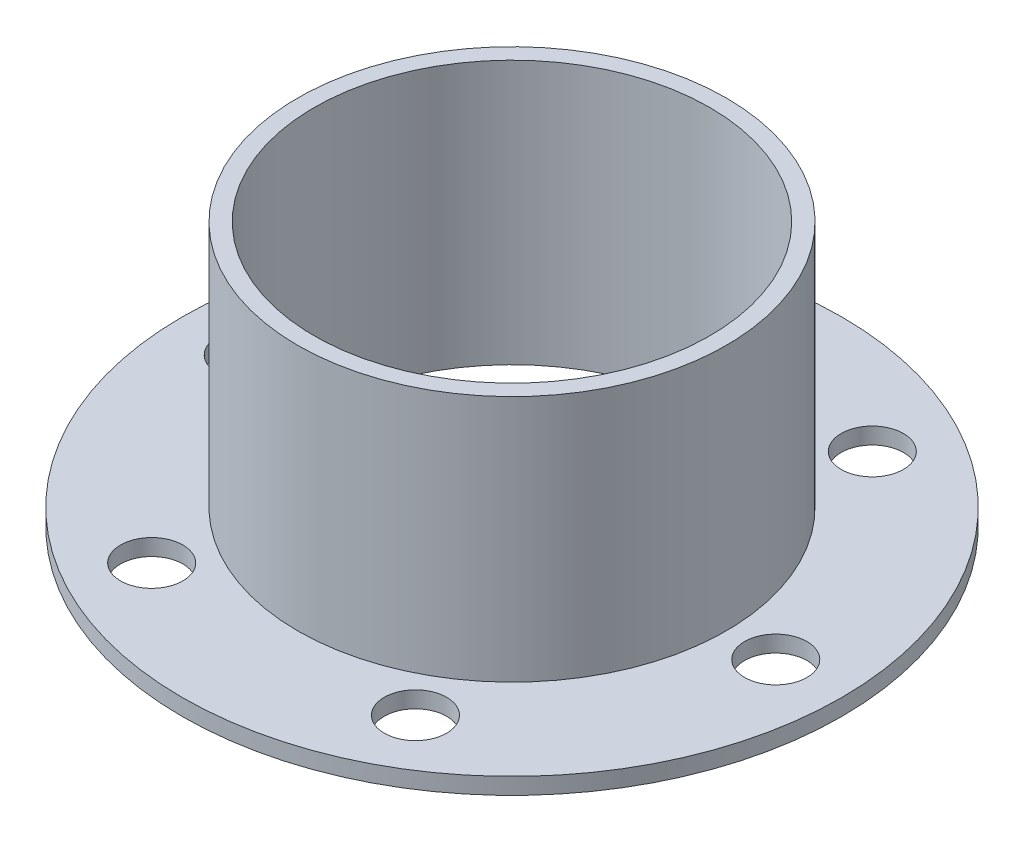
ISO-10303-21;
HEADER;
FILE_DESCRIPTION(('STEP AP214'),'2;1');
FILE_NAME('part.step','',(''),(''),'','','');
FILE_SCHEMA(('AUTOMOTIVE_DESIGN { 1 0 10303 214 1 1 1 1 }'));
ENDSEC;
DATA;
#1=APPLICATION_CONTEXT('core data for automotive mechanical design processes');
#2=APPLICATION_PROTOCOL_DEFINITION('international standard','automotive_design',2000,#1);
#3=PRODUCT_CONTEXT('',#1,'mechanical');
#4=PRODUCT('Part','Part','',(#3));
#5=PRODUCT_RELATED_PRODUCT_CATEGORY('part','',(#4));
#6=PRODUCT_DEFINITION_FORMATION('','',#4);
#7=PRODUCT_DEFINITION_CONTEXT('part definition',#1,'design');
#8=PRODUCT_DEFINITION('design','',#6,#7);
#9=PRODUCT_DEFINITION_SHAPE('','',#8);
#10=(LENGTH_UNIT() NAMED_UNIT(*) SI_UNIT(.MILLI.,.METRE.));
#11=(NAMED_UNIT(*) PLANE_ANGLE_UNIT() SI_UNIT($,.RADIAN.));
#12=(NAMED_UNIT(*) SI_UNIT($,.STERADIAN.) SOLID_ANGLE_UNIT());
#13=UNCERTAINTY_MEASURE_WITH_UNIT(LENGTH_MEASURE(1.E-05),#10,'distance_accuracy_value','');
#14=(GEOMETRIC_REPRESENTATION_CONTEXT(3) GLOBAL_UNCERTAINTY_ASSIGNED_CONTEXT((#13)) GLOBAL_UNIT_ASSIGNED_CONTEXT((#10,
#11,#12)) REPRESENTATION_CONTEXT('',''));
#15=CARTESIAN_POINT('',(0.,0.,0.));
#16=DIRECTION('',(0.,0.,1.));
#17=DIRECTION('',(1.,0.,0.));
#18=AXIS2_PLACEMENT_3D('',#15,#16,#17);
#19=CARTESIAN_POINT('',(-38.1,0.,0.));
#20=DIRECTION('',(0.,1.,0.));
#21=DIRECTION('',(0.,0.,1.));
#22=AXIS2_PLACEMENT_3D('',#19,#20,#21);
#23=PLANE('',#22);
#24=CARTESIAN_POINT('',(-25.4000000000005,0.,43.9940905122492));
#25=DIRECTION('',(0.,1.,0.));
#26=DIRECTION('',(0.866025403784433,0.,0.50000000000001));
#27=AXIS2_PLACEMENT_3D('',#24,#25,#26);
#28=CIRCLE('',#27,6.);
#29=CARTESIAN_POINT('',(-20.2038475772939,0.,46.9940905122493));
#30=VERTEX_POINT('',#29);
#31=EDGE_CURVE('E71',#30,#30,#28,.T.);
#32=ORIENTED_EDGE('',*,*,#31,.T.);
#33=EDGE_LOOP('',(#32));
#34=FACE_BOUND('',#33,.T.);
#35=CARTESIAN_POINT('',(25.3999999999996,0.,43.9940905122497));
#36=DIRECTION('',(0.,1.,0.));
#37=DIRECTION('',(0.866025403784443,0.,-0.499999999999992));
#38=AXIS2_PLACEMENT_3D('',#35,#36,#37);
#39=CIRCLE('',#38,6.);
#40=CARTESIAN_POINT('',(30.5961524227063,0.,40.9940905122498));
#41=VERTEX_POINT('',#40);
#42=EDGE_CURVE('E70',#41,#41,#39,.T.);
#43=ORIENTED_EDGE('',*,*,#42,.T.);
#44=EDGE_LOOP('',(#43));
#45=FACE_BOUND('',#44,.T.);
#46=CARTESIAN_POINT('',(50.8,0.,0.));
#47=DIRECTION('',(0.,1.,0.));
#48=DIRECTION('',(0.,0.,-1.));
#49=AXIS2_PLACEMENT_3D('',#46,#47,#48);
#50=CIRCLE('',#49,6.);
#51=CARTESIAN_POINT('',(50.8,0.,-6.));
#52=VERTEX_POINT('',#51);
#53=EDGE_CURVE('E77',#52,#52,#50,.T.);
#54=ORIENTED_EDGE('',*,*,#53,.T.);
#55=EDGE_LOOP('',(#54));
#56=FACE_BOUND('',#55,.T.);
#57=CARTESIAN_POINT('',(25.4000000000002,0.,-43.9940905122494));
#58=DIRECTION('',(0.,1.,0.));
#59=DIRECTION('',(-0.866025403784436,0.,-0.500000000000004));
#60=AXIS2_PLACEMENT_3D('',#57,#58,#59);
#61=CIRCLE('',#60,6.);
#62=CARTESIAN_POINT('',(20.2038475772936,0.,-46.9940905122494));
#63=VERTEX_POINT('',#62);
#64=EDGE_CURVE('E83',#63,#63,#61,.T.);
#65=ORIENTED_EDGE('',*,*,#64,.T.);
#66=EDGE_LOOP('',(#65));
#67=FACE_BOUND('',#66,.T.);
#68=CARTESIAN_POINT('',(-25.3999999999999,0.,-43.9940905122495));
#69=DIRECTION('',(0.,1.,0.));
#70=DIRECTION('',(-0.86602540378444,0.,0.499999999999998));
#71=AXIS2_PLACEMENT_3D('',#68,#69,#70);
#72=CIRCLE('',#71,6.);
#73=CARTESIAN_POINT('',(-30.5961524227065,0.,-40.9940905122495));
#74=VERTEX_POINT('',#73);
#75=EDGE_CURVE('E63',#74,#74,#72,.T.);
#76=ORIENTED_EDGE('',*,*,#75,.T.);
#77=EDGE_LOOP('',(#76));
#78=FACE_BOUND('',#77,.T.);
#79=CARTESIAN_POINT('',(-50.8,0.,0.));
#80=DIRECTION('',(0.,1.,0.));
#81=DIRECTION('',(0.,0.,1.));
#82=AXIS2_PLACEMENT_3D('',#79,#80,#81);
#83=CIRCLE('',#82,6.);
#84=CARTESIAN_POINT('',(-50.8,0.,6.));
#85=VERTEX_POINT('',#84);
#86=EDGE_CURVE('E57',#85,#85,#83,.T.);
#87=ORIENTED_EDGE('',*,*,#86,.T.);
#88=EDGE_LOOP('',(#87));
#89=FACE_BOUND('',#88,.T.);
#90=CARTESIAN_POINT('',(0.,0.,0.));
#91=DIRECTION('',(0.,-1.,0.));
#92=DIRECTION('',(0.,0.,-1.));
#93=AXIS2_PLACEMENT_3D('',#90,#91,#92);
#94=CIRCLE('',#93,38.1);
#95=CARTESIAN_POINT('',(0.,0.,-38.1));
#96=VERTEX_POINT('',#95);
#97=EDGE_CURVE('E54',#96,#96,#94,.T.);
#98=ORIENTED_EDGE('',*,*,#97,.F.);
#99=EDGE_LOOP('',(#98));
#100=FACE_BOUND('',#99,.T.);
#101=CARTESIAN_POINT('',(0.,0.,0.));
#102=DIRECTION('',(0.,-1.,0.));
#103=DIRECTION('',(0.,0.,-1.));
#104=AXIS2_PLACEMENT_3D('',#101,#102,#103);
#105=CIRCLE('',#104,63.5);
#106=CARTESIAN_POINT('',(0.,0.,-63.5));
#107=VERTEX_POINT('',#106);
#108=EDGE_CURVE('E10',#107,#107,#105,.T.);
#109=ORIENTED_EDGE('',*,*,#108,.T.);
#110=EDGE_LOOP('',(#109));
#111=FACE_BOUND('',#110,.T.);
#112=ADVANCED_FACE('F32',(#34,#45,#56,#67,#78,#89,#100,#111),#23,.F.);
#113=CARTESIAN_POINT('',(0.,0.,0.));
#114=DIRECTION('',(0.,-1.,0.));
#115=DIRECTION('',(0.,0.,-1.));
#116=AXIS2_PLACEMENT_3D('',#113,#114,#115);
#117=CYLINDRICAL_SURFACE('',#116,63.5);
#118=ORIENTED_EDGE('',*,*,#108,.F.);
#119=EDGE_LOOP('',(#118));
#120=FACE_BOUND('',#119,.T.);
#121=CARTESIAN_POINT('',(0.,3.175,0.));
#122=DIRECTION('',(0.,-1.,0.));
#123=DIRECTION('',(0.,0.,-1.));
#124=AXIS2_PLACEMENT_3D('',#121,#122,#123);
#125=CIRCLE('',#124,63.5);
#126=CARTESIAN_POINT('',(0.,3.175,-63.5));
#127=VERTEX_POINT('',#126);
#128=EDGE_CURVE('E39',#127,#127,#125,.T.);
#129=ORIENTED_EDGE('',*,*,#128,.T.);
#130=EDGE_LOOP('',(#129));
#131=FACE_BOUND('',#130,.T.);
#132=ADVANCED_FACE('F105',(#120,#131),#117,.T.);
#133=CARTESIAN_POINT('',(-63.5,3.175,0.));
#134=DIRECTION('',(0.,-1.,0.));
#135=DIRECTION('',(0.,0.,-1.));
#136=AXIS2_PLACEMENT_3D('',#133,#134,#135);
#137=PLANE('',#136);
#138=CARTESIAN_POINT('',(-25.4000000000005,3.175,43.9940905122492));
#139=DIRECTION('',(0.,-1.,0.));
#140=DIRECTION('',(-0.866025403784433,0.,-0.50000000000001));
#141=AXIS2_PLACEMENT_3D('',#138,#139,#140);
#142=CIRCLE('',#141,6.);
#143=CARTESIAN_POINT('',(-20.2038475772939,3.175,46.9940905122493));
#144=VERTEX_POINT('',#143);
#145=EDGE_CURVE('E67',#144,#144,#142,.T.);
#146=ORIENTED_EDGE('',*,*,#145,.T.);
#147=EDGE_LOOP('',(#146));
#148=FACE_BOUND('',#147,.T.);
#149=CARTESIAN_POINT('',(25.3999999999996,3.175,43.9940905122497));
#150=DIRECTION('',(0.,-1.,0.));
#151=DIRECTION('',(-0.866025403784443,0.,0.499999999999992));
#152=AXIS2_PLACEMENT_3D('',#149,#150,#151);
#153=CIRCLE('',#152,6.);
#154=CARTESIAN_POINT('',(30.5961524227063,3.175,40.9940905122498));
#155=VERTEX_POINT('',#154);
#156=EDGE_CURVE('E74',#155,#155,#153,.T.);
#157=ORIENTED_EDGE('',*,*,#156,.T.);
#158=EDGE_LOOP('',(#157));
#159=FACE_BOUND('',#158,.T.);
#160=CARTESIAN_POINT('',(50.8,3.175,0.));
#161=DIRECTION('',(0.,-1.,0.));
#162=DIRECTION('',(0.,0.,1.));
#163=AXIS2_PLACEMENT_3D('',#160,#161,#162);
#164=CIRCLE('',#163,6.);
#165=CARTESIAN_POINT('',(50.8,3.175,-6.));
#166=VERTEX_POINT('',#165);
#167=EDGE_CURVE('E80',#166,#166,#164,.T.);
#168=ORIENTED_EDGE('',*,*,#167,.T.);
#169=EDGE_LOOP('',(#168));
#170=FACE_BOUND('',#169,.T.);
#171=CARTESIAN_POINT('',(25.4000000000002,3.175,-43.9940905122494));
#172=DIRECTION('',(0.,-1.,0.));
#173=DIRECTION('',(0.866025403784436,0.,0.500000000000004));
#174=AXIS2_PLACEMENT_3D('',#171,#172,#173);
#175=CIRCLE('',#174,6.);
#176=CARTESIAN_POINT('',(20.2038475772936,3.175,-46.9940905122494));
#177=VERTEX_POINT('',#176);
#178=EDGE_CURVE('E66',#177,#177,#175,.T.);
#179=ORIENTED_EDGE('',*,*,#178,.T.);
#180=EDGE_LOOP('',(#179));
#181=FACE_BOUND('',#180,.T.);
#182=CARTESIAN_POINT('',(-25.3999999999999,3.175,-43.9940905122495));
#183=DIRECTION('',(0.,-1.,0.));
#184=DIRECTION('',(0.86602540378444,0.,-0.499999999999998));
#185=AXIS2_PLACEMENT_3D('',#182,#183,#184);
#186=CIRCLE('',#185,6.);
#187=CARTESIAN_POINT('',(-30.5961524227065,3.175,-40.9940905122495));
#188=VERTEX_POINT('',#187);
#189=EDGE_CURVE('E60',#188,#188,#186,.T.);
#190=ORIENTED_EDGE('',*,*,#189,.T.);
#191=EDGE_LOOP('',(#190));
#192=FACE_BOUND('',#191,.T.);
#193=CARTESIAN_POINT('',(-50.8,3.175,0.));
#194=DIRECTION('',(0.,-1.,0.));
#195=DIRECTION('',(0.,0.,-1.));
#196=AXIS2_PLACEMENT_3D('',#193,#194,#195);
#197=CIRCLE('',#196,6.);
#198=CARTESIAN_POINT('',(-50.8,3.175,6.));
#199=VERTEX_POINT('',#198);
#200=EDGE_CURVE('E35',#199,#199,#197,.T.);
#201=ORIENTED_EDGE('',*,*,#200,.T.);
#202=EDGE_LOOP('',(#201));
#203=FACE_BOUND('',#202,.T.);
#204=ORIENTED_EDGE('',*,*,#128,.F.);
#205=EDGE_LOOP('',(#204));
#206=FACE_BOUND('',#205,.T.);
#207=CARTESIAN_POINT('',(0.,3.175,0.));
#208=DIRECTION('',(0.,-1.,0.));
#209=DIRECTION('',(0.,0.,-1.));
#210=AXIS2_PLACEMENT_3D('',#207,#208,#209);
#211=CIRCLE('',#210,41.275);
#212=CARTESIAN_POINT('',(0.,3.175,-41.275));
#213=VERTEX_POINT('',#212);
#214=EDGE_CURVE('E43',#213,#213,#211,.T.);
#215=ORIENTED_EDGE('',*,*,#214,.T.);
#216=EDGE_LOOP('',(#215));
#217=FACE_BOUND('',#216,.T.);
#218=ADVANCED_FACE('F101',(#148,#159,#170,#181,#192,#203,#206,#217),#137,.F.);
#219=CARTESIAN_POINT('',(0.,0.,0.));
#220=DIRECTION('',(0.,-1.,0.));
#221=DIRECTION('',(0.,0.,-1.));
#222=AXIS2_PLACEMENT_3D('',#219,#220,#221);
#223=CYLINDRICAL_SURFACE('',#222,41.275);
#224=ORIENTED_EDGE('',*,*,#214,.F.);
#225=EDGE_LOOP('',(#224));
#226=FACE_BOUND('',#225,.T.);
#227=CARTESIAN_POINT('',(0.,50.8,0.));
#228=DIRECTION('',(0.,-1.,0.));
#229=DIRECTION('',(0.,0.,-1.));
#230=AXIS2_PLACEMENT_3D('',#227,#228,#229);
#231=CIRCLE('',#230,41.275);
#232=CARTESIAN_POINT('',(0.,50.8,-41.275));
#233=VERTEX_POINT('',#232);
#234=EDGE_CURVE('E48',#233,#233,#231,.T.);
#235=ORIENTED_EDGE('',*,*,#234,.T.);
#236=EDGE_LOOP('',(#235));
#237=FACE_BOUND('',#236,.T.);
#238=ADVANCED_FACE('F104',(#226,#237),#223,.T.);
#239=CARTESIAN_POINT('',(-41.275,50.8,0.));
#240=DIRECTION('',(0.,-1.,0.));
#241=DIRECTION('',(0.,0.,-1.));
#242=AXIS2_PLACEMENT_3D('',#239,#240,#241);
#243=PLANE('',#242);
#244=ORIENTED_EDGE('',*,*,#234,.F.);
#245=EDGE_LOOP('',(#244));
#246=FACE_BOUND('',#245,.T.);
#247=CARTESIAN_POINT('',(0.,50.8,0.));
#248=DIRECTION('',(0.,-1.,0.));
#249=DIRECTION('',(0.,0.,-1.));
#250=AXIS2_PLACEMENT_3D('',#247,#248,#249);
#251=CIRCLE('',#250,38.1);
#252=CARTESIAN_POINT('',(0.,50.8,-38.1));
#253=VERTEX_POINT('',#252);
#254=EDGE_CURVE('E51',#253,#253,#251,.T.);
#255=ORIENTED_EDGE('',*,*,#254,.T.);
#256=EDGE_LOOP('',(#255));
#257=FACE_BOUND('',#256,.T.);
#258=ADVANCED_FACE('F119',(#246,#257),#243,.F.);
#259=CARTESIAN_POINT('',(0.,0.,0.));
#260=DIRECTION('',(0.,-1.,0.));
#261=DIRECTION('',(0.,0.,-1.));
#262=AXIS2_PLACEMENT_3D('',#259,#260,#261);
#263=CYLINDRICAL_SURFACE('',#262,38.1);
#264=ORIENTED_EDGE('',*,*,#254,.F.);
#265=EDGE_LOOP('',(#264));
#266=FACE_BOUND('',#265,.T.);
#267=ORIENTED_EDGE('',*,*,#97,.T.);
#268=EDGE_LOOP('',(#267));
#269=FACE_BOUND('',#268,.T.);
#270=ADVANCED_FACE('F125',(#266,#269),#263,.F.);
#271=CARTESIAN_POINT('',(-50.8,0.,0.));
#272=DIRECTION('',(0.,1.,0.));
#273=DIRECTION('',(0.,0.,1.));
#274=AXIS2_PLACEMENT_3D('',#271,#272,#273);
#275=CYLINDRICAL_SURFACE('',#274,6.);
#276=CARTESIAN_POINT('',(-50.8,0.,6.));
#277=CARTESIAN_POINT('',(-50.8,0.0330729166666666,6.));
#278=CARTESIAN_POINT('',(-50.8,0.0661458333333333,6.));
#279=CARTESIAN_POINT('',(-50.8,0.132291666666667,6.));
#280=CARTESIAN_POINT('',(-50.8,0.165364583333333,6.));
#281=CARTESIAN_POINT('',(-50.8,0.231510416666666,6.));
#282=CARTESIAN_POINT('',(-50.8,0.264583333333333,6.));
#283=CARTESIAN_POINT('',(-50.8,0.330729166666666,6.));
#284=CARTESIAN_POINT('',(-50.8,0.363802083333333,6.));
#285=CARTESIAN_POINT('',(-50.8,0.429947916666666,6.));
#286=CARTESIAN_POINT('',(-50.8,0.463020833333333,6.));
#287=CARTESIAN_POINT('',(-50.8,0.529166666666666,6.));
#288=CARTESIAN_POINT('',(-50.8,0.562239583333333,6.));
#289=CARTESIAN_POINT('',(-50.8,0.628385416666666,6.));
#290=CARTESIAN_POINT('',(-50.8,0.661458333333333,6.));
#291=CARTESIAN_POINT('',(-50.8,0.727604166666666,6.));
#292=CARTESIAN_POINT('',(-50.8,0.760677083333333,6.));
#293=CARTESIAN_POINT('',(-50.8,0.826822916666666,6.));
#294=CARTESIAN_POINT('',(-50.8,0.859895833333333,6.));
#295=CARTESIAN_POINT('',(-50.8,0.926041666666666,6.));
#296=CARTESIAN_POINT('',(-50.8,0.959114583333332,6.));
#297=CARTESIAN_POINT('',(-50.8,1.02526041666667,6.));
#298=CARTESIAN_POINT('',(-50.8,1.05833333333333,6.));
#299=CARTESIAN_POINT('',(-50.8,1.12447916666667,6.));
#300=CARTESIAN_POINT('',(-50.8,1.15755208333333,6.));
#301=CARTESIAN_POINT('',(-50.8,1.22369791666667,6.));
#302=CARTESIAN_POINT('',(-50.8,1.25677083333333,6.));
#303=CARTESIAN_POINT('',(-50.8,1.32291666666667,6.));
#304=CARTESIAN_POINT('',(-50.8,1.35598958333333,6.));
#305=CARTESIAN_POINT('',(-50.8,1.42213541666667,6.));
#306=CARTESIAN_POINT('',(-50.8,1.45520833333333,6.));
#307=CARTESIAN_POINT('',(-50.8,1.52135416666667,6.));
#308=CARTESIAN_POINT('',(-50.8,1.55442708333333,6.));
#309=CARTESIAN_POINT('',(-50.8,1.62057291666667,6.));
#310=CARTESIAN_POINT('',(-50.8,1.65364583333333,6.));
#311=CARTESIAN_POINT('',(-50.8,1.71979166666667,6.));
#312=CARTESIAN_POINT('',(-50.8,1.75286458333333,6.));
#313=CARTESIAN_POINT('',(-50.8,1.81901041666666,6.));
#314=CARTESIAN_POINT('',(-50.8,1.85208333333333,6.));
#315=CARTESIAN_POINT('',(-50.8,1.91822916666666,6.));
#316=CARTESIAN_POINT('',(-50.8,1.95130208333333,6.));
#317=CARTESIAN_POINT('',(-50.8,2.01744791666666,6.));
#318=CARTESIAN_POINT('',(-50.8,2.05052083333333,6.));
#319=CARTESIAN_POINT('',(-50.8,2.11666666666666,6.));
#320=CARTESIAN_POINT('',(-50.8,2.14973958333333,6.));
#321=CARTESIAN_POINT('',(-50.8,2.21588541666666,6.));
#322=CARTESIAN_POINT('',(-50.8,2.24895833333333,6.));
#323=CARTESIAN_POINT('',(-50.8,2.31510416666666,6.));
#324=CARTESIAN_POINT('',(-50.8,2.34817708333333,6.));
#325=CARTESIAN_POINT('',(-50.8,2.41432291666666,6.));
#326=CARTESIAN_POINT('',(-50.8,2.44739583333333,6.));
#327=CARTESIAN_POINT('',(-50.8,2.51354166666666,6.));
#328=CARTESIAN_POINT('',(-50.8,2.54661458333333,6.));
#329=CARTESIAN_POINT('',(-50.8,2.61276041666666,6.));
#330=CARTESIAN_POINT('',(-50.8,2.64583333333333,6.));
#331=CARTESIAN_POINT('',(-50.8,2.71197916666666,6.));
#332=CARTESIAN_POINT('',(-50.8,2.74505208333333,6.));
#333=CARTESIAN_POINT('',(-50.8,2.81119791666666,6.));
#334=CARTESIAN_POINT('',(-50.8,2.84427083333333,6.));
#335=CARTESIAN_POINT('',(-50.8,2.91041666666666,6.));
#336=CARTESIAN_POINT('',(-50.8,2.94348958333333,6.));
#337=CARTESIAN_POINT('',(-50.8,3.00963541666666,6.));
#338=CARTESIAN_POINT('',(-50.8,3.04270833333333,6.));
#339=CARTESIAN_POINT('',(-50.8,3.10885416666666,6.));
#340=CARTESIAN_POINT('',(-50.8,3.14192708333333,6.));
#341=CARTESIAN_POINT('',(-50.8,3.175,6.));
#342=B_SPLINE_CURVE_WITH_KNOTS('',3,(#276,#277,#278,#279,#280,#281,#282,#283,#284,#285,#286,
#287,#288,#289,#290,#291,#292,#293,#294,#295,#296,#297,#298,#299,#300,#301,#302,#303,#304,#305,
#306,#307,#308,#309,#310,#311,#312,#313,#314,#315,#316,#317,#318,#319,#320,#321,#322,#323,#324,
#325,#326,#327,#328,#329,#330,#331,#332,#333,#334,#335,#336,#337,#338,#339,#340,#341),
.UNSPECIFIED.,.F.,.F.,(4,2,2,2,2,2,2,2,2,2,2,2,2,2,2,2,2,2,2,2,2,2,2,2,2,2,2,2,2,2,2,2,4),(0.,
0.0992187499999999,0.1984375,0.29765625,0.396875,0.496093749999999,0.595312499999999,
0.694531249999999,0.793749999999999,0.892968749999999,0.992187499999999,1.09140625,1.190625,
1.28984375,1.3890625,1.48828125,1.5875,1.68671875,1.7859375,1.88515625,1.984375,2.08359375,
2.1828125,2.28203125,2.38125,2.48046875,2.5796875,2.67890625,2.778125,2.87734375,2.9765625,
3.07578125,3.175),.UNSPECIFIED.);
#343=EDGE_CURVE('BSEAM131',#85,#199,#342,.T.);
#344=ORIENTED_EDGE('',*,*,#86,.F.);
#345=ORIENTED_EDGE('',*,*,#200,.F.);
#346=ORIENTED_EDGE('',*,*,#343,.T.);
#347=ORIENTED_EDGE('',*,*,#343,.F.);
#348=EDGE_LOOP('',(#344,#346,#345,#347));
#349=FACE_BOUND('',#348,.T.);
#350=ADVANCED_FACE('F131',(#349),#275,.F.);
#351=CARTESIAN_POINT('',(-25.3999999999999,0.,-43.9940905122495));
#352=DIRECTION('',(0.,1.,0.));
#353=DIRECTION('',(-0.86602540378444,0.,0.499999999999998));
#354=AXIS2_PLACEMENT_3D('',#351,#352,#353);
#355=CYLINDRICAL_SURFACE('',#354,6.);
#356=CARTESIAN_POINT('',(-30.5961524227065,0.,-40.9940905122495));
#357=CARTESIAN_POINT('',(-30.5961524227065,0.0330729166666666,-40.9940905122495));
#358=CARTESIAN_POINT('',(-30.5961524227065,0.0661458333333333,-40.9940905122495));
#359=CARTESIAN_POINT('',(-30.5961524227065,0.132291666666667,-40.9940905122495));
#360=CARTESIAN_POINT('',(-30.5961524227065,0.165364583333333,-40.9940905122495));
#361=CARTESIAN_POINT('',(-30.5961524227065,0.231510416666666,-40.9940905122495));
#362=CARTESIAN_POINT('',(-30.5961524227065,0.264583333333333,-40.9940905122495));
#363=CARTESIAN_POINT('',(-30.5961524227065,0.330729166666666,-40.9940905122495));
#364=CARTESIAN_POINT('',(-30.5961524227065,0.363802083333333,-40.9940905122495));
#365=CARTESIAN_POINT('',(-30.5961524227065,0.429947916666666,-40.9940905122495));
#366=CARTESIAN_POINT('',(-30.5961524227065,0.463020833333333,-40.9940905122495));
#367=CARTESIAN_POINT('',(-30.5961524227065,0.529166666666666,-40.9940905122495));
#368=CARTESIAN_POINT('',(-30.5961524227065,0.562239583333333,-40.9940905122495));
#369=CARTESIAN_POINT('',(-30.5961524227065,0.628385416666666,-40.9940905122495));
#370=CARTESIAN_POINT('',(-30.5961524227065,0.661458333333333,-40.9940905122495));
#371=CARTESIAN_POINT('',(-30.5961524227065,0.727604166666666,-40.9940905122495));
#372=CARTESIAN_POINT('',(-30.5961524227065,0.760677083333333,-40.9940905122495));
#373=CARTESIAN_POINT('',(-30.5961524227065,0.826822916666666,-40.9940905122495));
#374=CARTESIAN_POINT('',(-30.5961524227065,0.859895833333333,-40.9940905122495));
#375=CARTESIAN_POINT('',(-30.5961524227065,0.926041666666666,-40.9940905122495));
#376=CARTESIAN_POINT('',(-30.5961524227065,0.959114583333332,-40.9940905122495));
#377=CARTESIAN_POINT('',(-30.5961524227065,1.02526041666667,-40.9940905122495));
#378=CARTESIAN_POINT('',(-30.5961524227065,1.05833333333333,-40.9940905122495));
#379=CARTESIAN_POINT('',(-30.5961524227065,1.12447916666667,-40.9940905122495));
#380=CARTESIAN_POINT('',(-30.5961524227065,1.15755208333333,-40.9940905122495));
#381=CARTESIAN_POINT('',(-30.5961524227065,1.22369791666667,-40.9940905122495));
#382=CARTESIAN_POINT('',(-30.5961524227065,1.25677083333333,-40.9940905122495));
#383=CARTESIAN_POINT('',(-30.5961524227065,1.32291666666667,-40.9940905122495));
#384=CARTESIAN_POINT('',(-30.5961524227065,1.35598958333333,-40.9940905122495));
#385=CARTESIAN_POINT('',(-30.5961524227065,1.42213541666667,-40.9940905122495));
#386=CARTESIAN_POINT('',(-30.5961524227065,1.45520833333333,-40.9940905122495));
#387=CARTESIAN_POINT('',(-30.5961524227065,1.52135416666667,-40.9940905122495));
#388=CARTESIAN_POINT('',(-30.5961524227065,1.55442708333333,-40.9940905122495));
#389=CARTESIAN_POINT('',(-30.5961524227065,1.62057291666667,-40.9940905122495));
#390=CARTESIAN_POINT('',(-30.5961524227065,1.65364583333333,-40.9940905122495));
#391=CARTESIAN_POINT('',(-30.5961524227065,1.71979166666667,-40.9940905122495));
#392=CARTESIAN_POINT('',(-30.5961524227065,1.75286458333333,-40.9940905122495));
#393=CARTESIAN_POINT('',(-30.5961524227065,1.81901041666666,-40.9940905122495));
#394=CARTESIAN_POINT('',(-30.5961524227065,1.85208333333333,-40.9940905122495));
#395=CARTESIAN_POINT('',(-30.5961524227065,1.91822916666666,-40.9940905122495));
#396=CARTESIAN_POINT('',(-30.5961524227065,1.95130208333333,-40.9940905122495));
#397=CARTESIAN_POINT('',(-30.5961524227065,2.01744791666666,-40.9940905122495));
#398=CARTESIAN_POINT('',(-30.5961524227065,2.05052083333333,-40.9940905122495));
#399=CARTESIAN_POINT('',(-30.5961524227065,2.11666666666666,-40.9940905122495));
#400=CARTESIAN_POINT('',(-30.5961524227065,2.14973958333333,-40.9940905122495));
#401=CARTESIAN_POINT('',(-30.5961524227065,2.21588541666666,-40.9940905122495));
#402=CARTESIAN_POINT('',(-30.5961524227065,2.24895833333333,-40.9940905122495));
#403=CARTESIAN_POINT('',(-30.5961524227065,2.31510416666666,-40.9940905122495));
#404=CARTESIAN_POINT('',(-30.5961524227065,2.34817708333333,-40.9940905122495));
#405=CARTESIAN_POINT('',(-30.5961524227065,2.41432291666666,-40.9940905122495));
#406=CARTESIAN_POINT('',(-30.5961524227065,2.44739583333333,-40.9940905122495));
#407=CARTESIAN_POINT('',(-30.5961524227065,2.51354166666666,-40.9940905122495));
#408=CARTESIAN_POINT('',(-30.5961524227065,2.54661458333333,-40.9940905122495));
#409=CARTESIAN_POINT('',(-30.5961524227065,2.61276041666666,-40.9940905122495));
#410=CARTESIAN_POINT('',(-30.5961524227065,2.64583333333333,-40.9940905122495));
#411=CARTESIAN_POINT('',(-30.5961524227065,2.71197916666666,-40.9940905122495));
#412=CARTESIAN_POINT('',(-30.5961524227065,2.74505208333333,-40.9940905122495));
#413=CARTESIAN_POINT('',(-30.5961524227065,2.81119791666666,-40.9940905122495));
#414=CARTESIAN_POINT('',(-30.5961524227065,2.84427083333333,-40.9940905122495));
#415=CARTESIAN_POINT('',(-30.5961524227065,2.91041666666666,-40.9940905122495));
#416=CARTESIAN_POINT('',(-30.5961524227065,2.94348958333333,-40.9940905122495));
#417=CARTESIAN_POINT('',(-30.5961524227065,3.00963541666666,-40.9940905122495));
#418=CARTESIAN_POINT('',(-30.5961524227065,3.04270833333333,-40.9940905122495));
#419=CARTESIAN_POINT('',(-30.5961524227065,3.10885416666666,-40.9940905122495));
#420=CARTESIAN_POINT('',(-30.5961524227065,3.14192708333333,-40.9940905122495));
#421=CARTESIAN_POINT('',(-30.5961524227065,3.175,-40.9940905122495));
#422=B_SPLINE_CURVE_WITH_KNOTS('',3,(#356,#357,#358,#359,#360,#361,#362,#363,#364,#365,#366,
#367,#368,#369,#370,#371,#372,#373,#374,#375,#376,#377,#378,#379,#380,#381,#382,#383,#384,#385,
#386,#387,#388,#389,#390,#391,#392,#393,#394,#395,#396,#397,#398,#399,#400,#401,#402,#403,#404,
#405,#406,#407,#408,#409,#410,#411,#412,#413,#414,#415,#416,#417,#418,#419,#420,#421),
.UNSPECIFIED.,.F.,.F.,(4,2,2,2,2,2,2,2,2,2,2,2,2,2,2,2,2,2,2,2,2,2,2,2,2,2,2,2,2,2,2,2,4),(0.,
0.0992187499999999,0.1984375,0.29765625,0.396875,0.496093749999999,0.595312499999999,
0.694531249999999,0.793749999999999,0.892968749999999,0.992187499999999,1.09140625,1.190625,
1.28984375,1.3890625,1.48828125,1.5875,1.68671875,1.7859375,1.88515625,1.984375,2.08359375,
2.1828125,2.28203125,2.38125,2.48046875,2.5796875,2.67890625,2.778125,2.87734375,2.9765625,
3.07578125,3.175),.UNSPECIFIED.);
#423=EDGE_CURVE('BSEAM97',#74,#188,#422,.T.);
#424=ORIENTED_EDGE('',*,*,#75,.F.);
#425=ORIENTED_EDGE('',*,*,#189,.F.);
#426=ORIENTED_EDGE('',*,*,#423,.T.);
#427=ORIENTED_EDGE('',*,*,#423,.F.);
#428=EDGE_LOOP('',(#424,#426,#425,#427));
#429=FACE_BOUND('',#428,.T.);
#430=ADVANCED_FACE('F97',(#429),#355,.F.);
#431=CARTESIAN_POINT('',(25.4000000000002,0.,-43.9940905122494));
#432=DIRECTION('',(0.,1.,0.));
#433=DIRECTION('',(-0.866025403784436,0.,-0.500000000000004));
#434=AXIS2_PLACEMENT_3D('',#431,#432,#433);
#435=CYLINDRICAL_SURFACE('',#434,6.);
#436=CARTESIAN_POINT('',(20.2038475772936,0.,-46.9940905122494));
#437=CARTESIAN_POINT('',(20.2038475772936,0.0330729166666666,-46.9940905122494));
#438=CARTESIAN_POINT('',(20.2038475772936,0.0661458333333333,-46.9940905122494));
#439=CARTESIAN_POINT('',(20.2038475772936,0.132291666666667,-46.9940905122494));
#440=CARTESIAN_POINT('',(20.2038475772936,0.165364583333333,-46.9940905122494));
#441=CARTESIAN_POINT('',(20.2038475772936,0.231510416666666,-46.9940905122494));
#442=CARTESIAN_POINT('',(20.2038475772936,0.264583333333333,-46.9940905122494));
#443=CARTESIAN_POINT('',(20.2038475772936,0.330729166666666,-46.9940905122494));
#444=CARTESIAN_POINT('',(20.2038475772936,0.363802083333333,-46.9940905122494));
#445=CARTESIAN_POINT('',(20.2038475772936,0.429947916666666,-46.9940905122494));
#446=CARTESIAN_POINT('',(20.2038475772936,0.463020833333333,-46.9940905122494));
#447=CARTESIAN_POINT('',(20.2038475772936,0.529166666666666,-46.9940905122494));
#448=CARTESIAN_POINT('',(20.2038475772936,0.562239583333333,-46.9940905122494));
#449=CARTESIAN_POINT('',(20.2038475772936,0.628385416666666,-46.9940905122494));
#450=CARTESIAN_POINT('',(20.2038475772936,0.661458333333333,-46.9940905122494));
#451=CARTESIAN_POINT('',(20.2038475772936,0.727604166666666,-46.9940905122494));
#452=CARTESIAN_POINT('',(20.2038475772936,0.760677083333333,-46.9940905122494));
#453=CARTESIAN_POINT('',(20.2038475772936,0.826822916666666,-46.9940905122494));
#454=CARTESIAN_POINT('',(20.2038475772936,0.859895833333333,-46.9940905122494));
#455=CARTESIAN_POINT('',(20.2038475772936,0.926041666666666,-46.9940905122494));
#456=CARTESIAN_POINT('',(20.2038475772936,0.959114583333332,-46.9940905122494));
#457=CARTESIAN_POINT('',(20.2038475772936,1.02526041666667,-46.9940905122494));
#458=CARTESIAN_POINT('',(20.2038475772936,1.05833333333333,-46.9940905122494));
#459=CARTESIAN_POINT('',(20.2038475772936,1.12447916666667,-46.9940905122494));
#460=CARTESIAN_POINT('',(20.2038475772936,1.15755208333333,-46.9940905122494));
#461=CARTESIAN_POINT('',(20.2038475772936,1.22369791666667,-46.9940905122494));
#462=CARTESIAN_POINT('',(20.2038475772936,1.25677083333333,-46.9940905122494));
#463=CARTESIAN_POINT('',(20.2038475772936,1.32291666666667,-46.9940905122494));
#464=CARTESIAN_POINT('',(20.2038475772936,1.35598958333333,-46.9940905122494));
#465=CARTESIAN_POINT('',(20.2038475772936,1.42213541666667,-46.9940905122494));
#466=CARTESIAN_POINT('',(20.2038475772936,1.45520833333333,-46.9940905122494));
#467=CARTESIAN_POINT('',(20.2038475772936,1.52135416666667,-46.9940905122494));
#468=CARTESIAN_POINT('',(20.2038475772936,1.55442708333333,-46.9940905122494));
#469=CARTESIAN_POINT('',(20.2038475772936,1.62057291666667,-46.9940905122494));
#470=CARTESIAN_POINT('',(20.2038475772936,1.65364583333333,-46.9940905122494));
#471=CARTESIAN_POINT('',(20.2038475772936,1.71979166666667,-46.9940905122494));
#472=CARTESIAN_POINT('',(20.2038475772936,1.75286458333333,-46.9940905122494));
#473=CARTESIAN_POINT('',(20.2038475772936,1.81901041666666,-46.9940905122494));
#474=CARTESIAN_POINT('',(20.2038475772936,1.85208333333333,-46.9940905122494));
#475=CARTESIAN_POINT('',(20.2038475772936,1.91822916666666,-46.9940905122494));
#476=CARTESIAN_POINT('',(20.2038475772936,1.95130208333333,-46.9940905122494));
#477=CARTESIAN_POINT('',(20.2038475772936,2.01744791666666,-46.9940905122494));
#478=CARTESIAN_POINT('',(20.2038475772936,2.05052083333333,-46.9940905122494));
#479=CARTESIAN_POINT('',(20.2038475772936,2.11666666666666,-46.9940905122494));
#480=CARTESIAN_POINT('',(20.2038475772936,2.14973958333333,-46.9940905122494));
#481=CARTESIAN_POINT('',(20.2038475772936,2.21588541666666,-46.9940905122494));
#482=CARTESIAN_POINT('',(20.2038475772936,2.24895833333333,-46.9940905122494));
#483=CARTESIAN_POINT('',(20.2038475772936,2.31510416666666,-46.9940905122494));
#484=CARTESIAN_POINT('',(20.2038475772936,2.34817708333333,-46.9940905122494));
#485=CARTESIAN_POINT('',(20.2038475772936,2.41432291666666,-46.9940905122494));
#486=CARTESIAN_POINT('',(20.2038475772936,2.44739583333333,-46.9940905122494));
#487=CARTESIAN_POINT('',(20.2038475772936,2.51354166666666,-46.9940905122494));
#488=CARTESIAN_POINT('',(20.2038475772936,2.54661458333333,-46.9940905122494));
#489=CARTESIAN_POINT('',(20.2038475772936,2.61276041666666,-46.9940905122494));
#490=CARTESIAN_POINT('',(20.2038475772936,2.64583333333333,-46.9940905122494));
#491=CARTESIAN_POINT('',(20.2038475772936,2.71197916666666,-46.9940905122494));
#492=CARTESIAN_POINT('',(20.2038475772936,2.74505208333333,-46.9940905122494));
#493=CARTESIAN_POINT('',(20.2038475772936,2.81119791666666,-46.9940905122494));
#494=CARTESIAN_POINT('',(20.2038475772936,2.84427083333333,-46.9940905122494));
#495=CARTESIAN_POINT('',(20.2038475772936,2.91041666666666,-46.9940905122494));
#496=CARTESIAN_POINT('',(20.2038475772936,2.94348958333333,-46.9940905122494));
#497=CARTESIAN_POINT('',(20.2038475772936,3.00963541666666,-46.9940905122494));
#498=CARTESIAN_POINT('',(20.2038475772936,3.04270833333333,-46.9940905122494));
#499=CARTESIAN_POINT('',(20.2038475772936,3.10885416666666,-46.9940905122494));
#500=CARTESIAN_POINT('',(20.2038475772936,3.14192708333333,-46.9940905122494));
#501=CARTESIAN_POINT('',(20.2038475772936,3.175,-46.9940905122494));
#502=B_SPLINE_CURVE_WITH_KNOTS('',3,(#436,#437,#438,#439,#440,#441,#442,#443,#444,#445,#446,
#447,#448,#449,#450,#451,#452,#453,#454,#455,#456,#457,#458,#459,#460,#461,#462,#463,#464,#465,
#466,#467,#468,#469,#470,#471,#472,#473,#474,#475,#476,#477,#478,#479,#480,#481,#482,#483,#484,
#485,#486,#487,#488,#489,#490,#491,#492,#493,#494,#495,#496,#497,#498,#499,#500,#501),
.UNSPECIFIED.,.F.,.F.,(4,2,2,2,2,2,2,2,2,2,2,2,2,2,2,2,2,2,2,2,2,2,2,2,2,2,2,2,2,2,2,2,4),(0.,
0.0992187499999999,0.1984375,0.29765625,0.396875,0.496093749999999,0.595312499999999,
0.694531249999999,0.793749999999999,0.892968749999999,0.992187499999999,1.09140625,1.190625,
1.28984375,1.3890625,1.48828125,1.5875,1.68671875,1.7859375,1.88515625,1.984375,2.08359375,
2.1828125,2.28203125,2.38125,2.48046875,2.5796875,2.67890625,2.778125,2.87734375,2.9765625,
3.07578125,3.175),.UNSPECIFIED.);
#503=EDGE_CURVE('BSEAM93',#63,#177,#502,.T.);
#504=ORIENTED_EDGE('',*,*,#64,.F.);
#505=ORIENTED_EDGE('',*,*,#178,.F.);
#506=ORIENTED_EDGE('',*,*,#503,.T.);
#507=ORIENTED_EDGE('',*,*,#503,.F.);
#508=EDGE_LOOP('',(#504,#506,#505,#507));
#509=FACE_BOUND('',#508,.T.);
#510=ADVANCED_FACE('F93',(#509),#435,.F.);
#511=CARTESIAN_POINT('',(50.8,0.,0.));
#512=DIRECTION('',(0.,1.,0.));
#513=DIRECTION('',(0.,0.,-1.));
#514=AXIS2_PLACEMENT_3D('',#511,#512,#513);
#515=CYLINDRICAL_SURFACE('',#514,6.);
#516=CARTESIAN_POINT('',(50.8,0.,-6.));
#517=CARTESIAN_POINT('',(50.8,0.0330729166666666,-6.));
#518=CARTESIAN_POINT('',(50.8,0.0661458333333333,-6.));
#519=CARTESIAN_POINT('',(50.8,0.132291666666667,-6.));
#520=CARTESIAN_POINT('',(50.8,0.165364583333333,-6.));
#521=CARTESIAN_POINT('',(50.8,0.231510416666666,-6.));
#522=CARTESIAN_POINT('',(50.8,0.264583333333333,-6.));
#523=CARTESIAN_POINT('',(50.8,0.330729166666666,-6.));
#524=CARTESIAN_POINT('',(50.8,0.363802083333333,-6.));
#525=CARTESIAN_POINT('',(50.8,0.429947916666666,-6.));
#526=CARTESIAN_POINT('',(50.8,0.463020833333333,-6.));
#527=CARTESIAN_POINT('',(50.8,0.529166666666666,-6.));
#528=CARTESIAN_POINT('',(50.8,0.562239583333333,-6.));
#529=CARTESIAN_POINT('',(50.8,0.628385416666666,-6.));
#530=CARTESIAN_POINT('',(50.8,0.661458333333333,-6.));
#531=CARTESIAN_POINT('',(50.8,0.727604166666666,-6.));
#532=CARTESIAN_POINT('',(50.8,0.760677083333333,-6.));
#533=CARTESIAN_POINT('',(50.8,0.826822916666666,-6.));
#534=CARTESIAN_POINT('',(50.8,0.859895833333333,-6.));
#535=CARTESIAN_POINT('',(50.8,0.926041666666666,-6.));
#536=CARTESIAN_POINT('',(50.8,0.959114583333332,-6.));
#537=CARTESIAN_POINT('',(50.8,1.02526041666667,-6.));
#538=CARTESIAN_POINT('',(50.8,1.05833333333333,-6.));
#539=CARTESIAN_POINT('',(50.8,1.12447916666667,-6.));
#540=CARTESIAN_POINT('',(50.8,1.15755208333333,-6.));
#541=CARTESIAN_POINT('',(50.8,1.22369791666667,-6.));
#542=CARTESIAN_POINT('',(50.8,1.25677083333333,-6.));
#543=CARTESIAN_POINT('',(50.8,1.32291666666667,-6.));
#544=CARTESIAN_POINT('',(50.8,1.35598958333333,-6.));
#545=CARTESIAN_POINT('',(50.8,1.42213541666667,-6.));
#546=CARTESIAN_POINT('',(50.8,1.45520833333333,-6.));
#547=CARTESIAN_POINT('',(50.8,1.52135416666667,-6.));
#548=CARTESIAN_POINT('',(50.8,1.55442708333333,-6.));
#549=CARTESIAN_POINT('',(50.8,1.62057291666667,-6.));
#550=CARTESIAN_POINT('',(50.8,1.65364583333333,-6.));
#551=CARTESIAN_POINT('',(50.8,1.71979166666667,-6.));
#552=CARTESIAN_POINT('',(50.8,1.75286458333333,-6.));
#553=CARTESIAN_POINT('',(50.8,1.81901041666666,-6.));
#554=CARTESIAN_POINT('',(50.8,1.85208333333333,-6.));
#555=CARTESIAN_POINT('',(50.8,1.91822916666666,-6.));
#556=CARTESIAN_POINT('',(50.8,1.95130208333333,-6.));
#557=CARTESIAN_POINT('',(50.8,2.01744791666666,-6.));
#558=CARTESIAN_POINT('',(50.8,2.05052083333333,-6.));
#559=CARTESIAN_POINT('',(50.8,2.11666666666666,-6.));
#560=CARTESIAN_POINT('',(50.8,2.14973958333333,-6.));
#561=CARTESIAN_POINT('',(50.8,2.21588541666666,-6.));
#562=CARTESIAN_POINT('',(50.8,2.24895833333333,-6.));
#563=CARTESIAN_POINT('',(50.8,2.31510416666666,-6.));
#564=CARTESIAN_POINT('',(50.8,2.34817708333333,-6.));
#565=CARTESIAN_POINT('',(50.8,2.41432291666666,-6.));
#566=CARTESIAN_POINT('',(50.8,2.44739583333333,-6.));
#567=CARTESIAN_POINT('',(50.8,2.51354166666666,-6.));
#568=CARTESIAN_POINT('',(50.8,2.54661458333333,-6.));
#569=CARTESIAN_POINT('',(50.8,2.61276041666666,-6.));
#570=CARTESIAN_POINT('',(50.8,2.64583333333333,-6.));
#571=CARTESIAN_POINT('',(50.8,2.71197916666666,-6.));
#572=CARTESIAN_POINT('',(50.8,2.74505208333333,-6.));
#573=CARTESIAN_POINT('',(50.8,2.81119791666666,-6.));
#574=CARTESIAN_POINT('',(50.8,2.84427083333333,-6.));
#575=CARTESIAN_POINT('',(50.8,2.91041666666666,-6.));
#576=CARTESIAN_POINT('',(50.8,2.94348958333333,-6.));
#577=CARTESIAN_POINT('',(50.8,3.00963541666666,-6.));
#578=CARTESIAN_POINT('',(50.8,3.04270833333333,-6.));
#579=CARTESIAN_POINT('',(50.8,3.10885416666666,-6.));
#580=CARTESIAN_POINT('',(50.8,3.14192708333333,-6.));
#581=CARTESIAN_POINT('',(50.8,3.175,-6.));
#582=B_SPLINE_CURVE_WITH_KNOTS('',3,(#516,#517,#518,#519,#520,#521,#522,#523,#524,#525,#526,
#527,#528,#529,#530,#531,#532,#533,#534,#535,#536,#537,#538,#539,#540,#541,#542,#543,#544,#545,
#546,#547,#548,#549,#550,#551,#552,#553,#554,#555,#556,#557,#558,#559,#560,#561,#562,#563,#564,
#565,#566,#567,#568,#569,#570,#571,#572,#573,#574,#575,#576,#577,#578,#579,#580,#581),
.UNSPECIFIED.,.F.,.F.,(4,2,2,2,2,2,2,2,2,2,2,2,2,2,2,2,2,2,2,2,2,2,2,2,2,2,2,2,2,2,2,2,4),(0.,
0.0992187499999999,0.1984375,0.29765625,0.396875,0.496093749999999,0.595312499999999,
0.694531249999999,0.793749999999999,0.892968749999999,0.992187499999999,1.09140625,1.190625,
1.28984375,1.3890625,1.48828125,1.5875,1.68671875,1.7859375,1.88515625,1.984375,2.08359375,
2.1828125,2.28203125,2.38125,2.48046875,2.5796875,2.67890625,2.778125,2.87734375,2.9765625,
3.07578125,3.175),.UNSPECIFIED.);
#583=EDGE_CURVE('BSEAM96',#52,#166,#582,.T.);
#584=ORIENTED_EDGE('',*,*,#53,.F.);
#585=ORIENTED_EDGE('',*,*,#167,.F.);
#586=ORIENTED_EDGE('',*,*,#583,.T.);
#587=ORIENTED_EDGE('',*,*,#583,.F.);
#588=EDGE_LOOP('',(#584,#586,#585,#587));
#589=FACE_BOUND('',#588,.T.);
#590=ADVANCED_FACE('F96',(#589),#515,.F.);
#591=CARTESIAN_POINT('',(25.3999999999996,0.,43.9940905122497));
#592=DIRECTION('',(0.,1.,0.));
#593=DIRECTION('',(0.866025403784443,0.,-0.499999999999992));
#594=AXIS2_PLACEMENT_3D('',#591,#592,#593);
#595=CYLINDRICAL_SURFACE('',#594,6.);
#596=CARTESIAN_POINT('',(30.5961524227063,0.,40.9940905122498));
#597=CARTESIAN_POINT('',(30.5961524227063,0.0330729166666666,40.9940905122498));
#598=CARTESIAN_POINT('',(30.5961524227063,0.0661458333333333,40.9940905122498));
#599=CARTESIAN_POINT('',(30.5961524227063,0.132291666666667,40.9940905122498));
#600=CARTESIAN_POINT('',(30.5961524227063,0.165364583333333,40.9940905122498));
#601=CARTESIAN_POINT('',(30.5961524227063,0.231510416666666,40.9940905122498));
#602=CARTESIAN_POINT('',(30.5961524227063,0.264583333333333,40.9940905122498));
#603=CARTESIAN_POINT('',(30.5961524227063,0.330729166666666,40.9940905122498));
#604=CARTESIAN_POINT('',(30.5961524227063,0.363802083333333,40.9940905122498));
#605=CARTESIAN_POINT('',(30.5961524227063,0.429947916666666,40.9940905122498));
#606=CARTESIAN_POINT('',(30.5961524227063,0.463020833333333,40.9940905122498));
#607=CARTESIAN_POINT('',(30.5961524227063,0.529166666666666,40.9940905122498));
#608=CARTESIAN_POINT('',(30.5961524227063,0.562239583333333,40.9940905122498));
#609=CARTESIAN_POINT('',(30.5961524227063,0.628385416666666,40.9940905122498));
#610=CARTESIAN_POINT('',(30.5961524227063,0.661458333333333,40.9940905122498));
#611=CARTESIAN_POINT('',(30.5961524227063,0.727604166666666,40.9940905122498));
#612=CARTESIAN_POINT('',(30.5961524227063,0.760677083333333,40.9940905122498));
#613=CARTESIAN_POINT('',(30.5961524227063,0.826822916666666,40.9940905122498));
#614=CARTESIAN_POINT('',(30.5961524227063,0.859895833333333,40.9940905122498));
#615=CARTESIAN_POINT('',(30.5961524227063,0.926041666666666,40.9940905122498));
#616=CARTESIAN_POINT('',(30.5961524227063,0.959114583333332,40.9940905122498));
#617=CARTESIAN_POINT('',(30.5961524227063,1.02526041666667,40.9940905122498));
#618=CARTESIAN_POINT('',(30.5961524227063,1.05833333333333,40.9940905122498));
#619=CARTESIAN_POINT('',(30.5961524227063,1.12447916666667,40.9940905122498));
#620=CARTESIAN_POINT('',(30.5961524227063,1.15755208333333,40.9940905122498));
#621=CARTESIAN_POINT('',(30.5961524227063,1.22369791666667,40.9940905122498));
#622=CARTESIAN_POINT('',(30.5961524227063,1.25677083333333,40.9940905122498));
#623=CARTESIAN_POINT('',(30.5961524227063,1.32291666666667,40.9940905122498));
#624=CARTESIAN_POINT('',(30.5961524227063,1.35598958333333,40.9940905122498));
#625=CARTESIAN_POINT('',(30.5961524227063,1.42213541666667,40.9940905122498));
#626=CARTESIAN_POINT('',(30.5961524227063,1.45520833333333,40.9940905122498));
#627=CARTESIAN_POINT('',(30.5961524227063,1.52135416666667,40.9940905122498));
#628=CARTESIAN_POINT('',(30.5961524227063,1.55442708333333,40.9940905122498));
#629=CARTESIAN_POINT('',(30.5961524227063,1.62057291666667,40.9940905122498));
#630=CARTESIAN_POINT('',(30.5961524227063,1.65364583333333,40.9940905122498));
#631=CARTESIAN_POINT('',(30.5961524227063,1.71979166666667,40.9940905122498));
#632=CARTESIAN_POINT('',(30.5961524227063,1.75286458333333,40.9940905122498));
#633=CARTESIAN_POINT('',(30.5961524227063,1.81901041666666,40.9940905122498));
#634=CARTESIAN_POINT('',(30.5961524227063,1.85208333333333,40.9940905122498));
#635=CARTESIAN_POINT('',(30.5961524227063,1.91822916666666,40.9940905122498));
#636=CARTESIAN_POINT('',(30.5961524227063,1.95130208333333,40.9940905122498));
#637=CARTESIAN_POINT('',(30.5961524227063,2.01744791666666,40.9940905122498));
#638=CARTESIAN_POINT('',(30.5961524227063,2.05052083333333,40.9940905122498));
#639=CARTESIAN_POINT('',(30.5961524227063,2.11666666666666,40.9940905122498));
#640=CARTESIAN_POINT('',(30.5961524227063,2.14973958333333,40.9940905122498));
#641=CARTESIAN_POINT('',(30.5961524227063,2.21588541666666,40.9940905122498));
#642=CARTESIAN_POINT('',(30.5961524227063,2.24895833333333,40.9940905122498));
#643=CARTESIAN_POINT('',(30.5961524227063,2.31510416666666,40.9940905122498));
#644=CARTESIAN_POINT('',(30.5961524227063,2.34817708333333,40.9940905122498));
#645=CARTESIAN_POINT('',(30.5961524227063,2.41432291666666,40.9940905122498));
#646=CARTESIAN_POINT('',(30.5961524227063,2.44739583333333,40.9940905122498));
#647=CARTESIAN_POINT('',(30.5961524227063,2.51354166666666,40.9940905122498));
#648=CARTESIAN_POINT('',(30.5961524227063,2.54661458333333,40.9940905122498));
#649=CARTESIAN_POINT('',(30.5961524227063,2.61276041666666,40.9940905122498));
#650=CARTESIAN_POINT('',(30.5961524227063,2.64583333333333,40.9940905122498));
#651=CARTESIAN_POINT('',(30.5961524227063,2.71197916666666,40.9940905122498));
#652=CARTESIAN_POINT('',(30.5961524227063,2.74505208333333,40.9940905122498));
#653=CARTESIAN_POINT('',(30.5961524227063,2.81119791666666,40.9940905122498));
#654=CARTESIAN_POINT('',(30.5961524227063,2.84427083333333,40.9940905122498));
#655=CARTESIAN_POINT('',(30.5961524227063,2.91041666666666,40.9940905122498));
#656=CARTESIAN_POINT('',(30.5961524227063,2.94348958333333,40.9940905122498));
#657=CARTESIAN_POINT('',(30.5961524227063,3.00963541666666,40.9940905122498));
#658=CARTESIAN_POINT('',(30.5961524227063,3.04270833333333,40.9940905122498));
#659=CARTESIAN_POINT('',(30.5961524227063,3.10885416666666,40.9940905122498));
#660=CARTESIAN_POINT('',(30.5961524227063,3.14192708333333,40.9940905122498));
#661=CARTESIAN_POINT('',(30.5961524227063,3.175,40.9940905122498));
#662=B_SPLINE_CURVE_WITH_KNOTS('',3,(#596,#597,#598,#599,#600,#601,#602,#603,#604,#605,#606,
#607,#608,#609,#610,#611,#612,#613,#614,#615,#616,#617,#618,#619,#620,#621,#622,#623,#624,#625,
#626,#627,#628,#629,#630,#631,#632,#633,#634,#635,#636,#637,#638,#639,#640,#641,#642,#643,#644,
#645,#646,#647,#648,#649,#650,#651,#652,#653,#654,#655,#656,#657,#658,#659,#660,#661),
.UNSPECIFIED.,.F.,.F.,(4,2,2,2,2,2,2,2,2,2,2,2,2,2,2,2,2,2,2,2,2,2,2,2,2,2,2,2,2,2,2,2,4),(0.,
0.0992187499999999,0.1984375,0.29765625,0.396875,0.496093749999999,0.595312499999999,
0.694531249999999,0.793749999999999,0.892968749999999,0.992187499999999,1.09140625,1.190625,
1.28984375,1.3890625,1.48828125,1.5875,1.68671875,1.7859375,1.88515625,1.984375,2.08359375,
2.1828125,2.28203125,2.38125,2.48046875,2.5796875,2.67890625,2.778125,2.87734375,2.9765625,
3.07578125,3.175),.UNSPECIFIED.);
#663=EDGE_CURVE('BSEAM149',#41,#155,#662,.T.);
#664=ORIENTED_EDGE('',*,*,#42,.F.);
#665=ORIENTED_EDGE('',*,*,#156,.F.);
#666=ORIENTED_EDGE('',*,*,#663,.T.);
#667=ORIENTED_EDGE('',*,*,#663,.F.);
#668=EDGE_LOOP('',(#664,#666,#665,#667));
#669=FACE_BOUND('',#668,.T.);
#670=ADVANCED_FACE('F149',(#669),#595,.F.);
#671=CARTESIAN_POINT('',(-25.4000000000005,0.,43.9940905122492));
#672=DIRECTION('',(0.,1.,0.));
#673=DIRECTION('',(0.866025403784433,0.,0.50000000000001));
#674=AXIS2_PLACEMENT_3D('',#671,#672,#673);
#675=CYLINDRICAL_SURFACE('',#674,6.);
#676=CARTESIAN_POINT('',(-20.2038475772939,0.,46.9940905122493));
#677=CARTESIAN_POINT('',(-20.2038475772939,0.0330729166666666,46.9940905122493));
#678=CARTESIAN_POINT('',(-20.2038475772939,0.0661458333333333,46.9940905122493));
#679=CARTESIAN_POINT('',(-20.2038475772939,0.132291666666667,46.9940905122493));
#680=CARTESIAN_POINT('',(-20.2038475772939,0.165364583333333,46.9940905122493));
#681=CARTESIAN_POINT('',(-20.2038475772939,0.231510416666666,46.9940905122493));
#682=CARTESIAN_POINT('',(-20.2038475772939,0.264583333333333,46.9940905122493));
#683=CARTESIAN_POINT('',(-20.2038475772939,0.330729166666666,46.9940905122493));
#684=CARTESIAN_POINT('',(-20.2038475772939,0.363802083333333,46.9940905122493));
#685=CARTESIAN_POINT('',(-20.2038475772939,0.429947916666666,46.9940905122493));
#686=CARTESIAN_POINT('',(-20.2038475772939,0.463020833333333,46.9940905122493));
#687=CARTESIAN_POINT('',(-20.2038475772939,0.529166666666666,46.9940905122493));
#688=CARTESIAN_POINT('',(-20.2038475772939,0.562239583333333,46.9940905122493));
#689=CARTESIAN_POINT('',(-20.2038475772939,0.628385416666666,46.9940905122493));
#690=CARTESIAN_POINT('',(-20.2038475772939,0.661458333333333,46.9940905122493));
#691=CARTESIAN_POINT('',(-20.2038475772939,0.727604166666666,46.9940905122493));
#692=CARTESIAN_POINT('',(-20.2038475772939,0.760677083333333,46.9940905122493));
#693=CARTESIAN_POINT('',(-20.2038475772939,0.826822916666666,46.9940905122493));
#694=CARTESIAN_POINT('',(-20.2038475772939,0.859895833333333,46.9940905122493));
#695=CARTESIAN_POINT('',(-20.2038475772939,0.926041666666666,46.9940905122493));
#696=CARTESIAN_POINT('',(-20.2038475772939,0.959114583333332,46.9940905122493));
#697=CARTESIAN_POINT('',(-20.2038475772939,1.02526041666667,46.9940905122493));
#698=CARTESIAN_POINT('',(-20.2038475772939,1.05833333333333,46.9940905122493));
#699=CARTESIAN_POINT('',(-20.2038475772939,1.12447916666667,46.9940905122493));
#700=CARTESIAN_POINT('',(-20.2038475772939,1.15755208333333,46.9940905122493));
#701=CARTESIAN_POINT('',(-20.2038475772939,1.22369791666667,46.9940905122493));
#702=CARTESIAN_POINT('',(-20.2038475772939,1.25677083333333,46.9940905122493));
#703=CARTESIAN_POINT('',(-20.2038475772939,1.32291666666667,46.9940905122493));
#704=CARTESIAN_POINT('',(-20.2038475772939,1.35598958333333,46.9940905122493));
#705=CARTESIAN_POINT('',(-20.2038475772939,1.42213541666667,46.9940905122493));
#706=CARTESIAN_POINT('',(-20.2038475772939,1.45520833333333,46.9940905122493));
#707=CARTESIAN_POINT('',(-20.2038475772939,1.52135416666667,46.9940905122493));
#708=CARTESIAN_POINT('',(-20.2038475772939,1.55442708333333,46.9940905122493));
#709=CARTESIAN_POINT('',(-20.2038475772939,1.62057291666667,46.9940905122493));
#710=CARTESIAN_POINT('',(-20.2038475772939,1.65364583333333,46.9940905122493));
#711=CARTESIAN_POINT('',(-20.2038475772939,1.71979166666667,46.9940905122493));
#712=CARTESIAN_POINT('',(-20.2038475772939,1.75286458333333,46.9940905122493));
#713=CARTESIAN_POINT('',(-20.2038475772939,1.81901041666666,46.9940905122493));
#714=CARTESIAN_POINT('',(-20.2038475772939,1.85208333333333,46.9940905122493));
#715=CARTESIAN_POINT('',(-20.2038475772939,1.91822916666666,46.9940905122493));
#716=CARTESIAN_POINT('',(-20.2038475772939,1.95130208333333,46.9940905122493));
#717=CARTESIAN_POINT('',(-20.2038475772939,2.01744791666666,46.9940905122493));
#718=CARTESIAN_POINT('',(-20.2038475772939,2.05052083333333,46.9940905122493));
#719=CARTESIAN_POINT('',(-20.2038475772939,2.11666666666666,46.9940905122493));
#720=CARTESIAN_POINT('',(-20.2038475772939,2.14973958333333,46.9940905122493));
#721=CARTESIAN_POINT('',(-20.2038475772939,2.21588541666666,46.9940905122493));
#722=CARTESIAN_POINT('',(-20.2038475772939,2.24895833333333,46.9940905122493));
#723=CARTESIAN_POINT('',(-20.2038475772939,2.31510416666666,46.9940905122493));
#724=CARTESIAN_POINT('',(-20.2038475772939,2.34817708333333,46.9940905122493));
#725=CARTESIAN_POINT('',(-20.2038475772939,2.41432291666666,46.9940905122493));
#726=CARTESIAN_POINT('',(-20.2038475772939,2.44739583333333,46.9940905122493));
#727=CARTESIAN_POINT('',(-20.2038475772939,2.51354166666666,46.9940905122493));
#728=CARTESIAN_POINT('',(-20.2038475772939,2.54661458333333,46.9940905122493));
#729=CARTESIAN_POINT('',(-20.2038475772939,2.61276041666666,46.9940905122493));
#730=CARTESIAN_POINT('',(-20.2038475772939,2.64583333333333,46.9940905122493));
#731=CARTESIAN_POINT('',(-20.2038475772939,2.71197916666666,46.9940905122493));
#732=CARTESIAN_POINT('',(-20.2038475772939,2.74505208333333,46.9940905122493));
#733=CARTESIAN_POINT('',(-20.2038475772939,2.81119791666666,46.9940905122493));
#734=CARTESIAN_POINT('',(-20.2038475772939,2.84427083333333,46.9940905122493));
#735=CARTESIAN_POINT('',(-20.2038475772939,2.91041666666666,46.9940905122493));
#736=CARTESIAN_POINT('',(-20.2038475772939,2.94348958333333,46.9940905122493));
#737=CARTESIAN_POINT('',(-20.2038475772939,3.00963541666666,46.9940905122493));
#738=CARTESIAN_POINT('',(-20.2038475772939,3.04270833333333,46.9940905122493));
#739=CARTESIAN_POINT('',(-20.2038475772939,3.10885416666666,46.9940905122493));
#740=CARTESIAN_POINT('',(-20.2038475772939,3.14192708333333,46.9940905122493));
#741=CARTESIAN_POINT('',(-20.2038475772939,3.175,46.9940905122493));
#742=B_SPLINE_CURVE_WITH_KNOTS('',3,(#676,#677,#678,#679,#680,#681,#682,#683,#684,#685,#686,
#687,#688,#689,#690,#691,#692,#693,#694,#695,#696,#697,#698,#699,#700,#701,#702,#703,#704,#705,
#706,#707,#708,#709,#710,#711,#712,#713,#714,#715,#716,#717,#718,#719,#720,#721,#722,#723,#724,
#725,#726,#727,#728,#729,#730,#731,#732,#733,#734,#735,#736,#737,#738,#739,#740,#741),
.UNSPECIFIED.,.F.,.F.,(4,2,2,2,2,2,2,2,2,2,2,2,2,2,2,2,2,2,2,2,2,2,2,2,2,2,2,2,2,2,2,2,4),(0.,
0.0992187499999999,0.1984375,0.29765625,0.396875,0.496093749999999,0.595312499999999,
0.694531249999999,0.793749999999999,0.892968749999999,0.992187499999999,1.09140625,1.190625,
1.28984375,1.3890625,1.48828125,1.5875,1.68671875,1.7859375,1.88515625,1.984375,2.08359375,
2.1828125,2.28203125,2.38125,2.48046875,2.5796875,2.67890625,2.778125,2.87734375,2.9765625,
3.07578125,3.175),.UNSPECIFIED.);
#743=EDGE_CURVE('BSEAM156',#30,#144,#742,.T.);
#744=ORIENTED_EDGE('',*,*,#31,.F.);
#745=ORIENTED_EDGE('',*,*,#145,.F.);
#746=ORIENTED_EDGE('',*,*,#743,.T.);
#747=ORIENTED_EDGE('',*,*,#743,.F.);
#748=EDGE_LOOP('',(#744,#746,#745,#747));
#749=FACE_BOUND('',#748,.T.);
#750=ADVANCED_FACE('F156',(#749),#675,.F.);
#751=CLOSED_SHELL('',(#112,#132,#218,#238,#258,#270,#350,#430,#510,#590,#670,#750));
#752=MANIFOLD_SOLID_BREP('B2',#751);
#753=ADVANCED_BREP_SHAPE_REPRESENTATION('',(#18,#752),#14);
#754=SHAPE_DEFINITION_REPRESENTATION(#9,#753);
ENDSEC;
END-ISO-10303-21;
